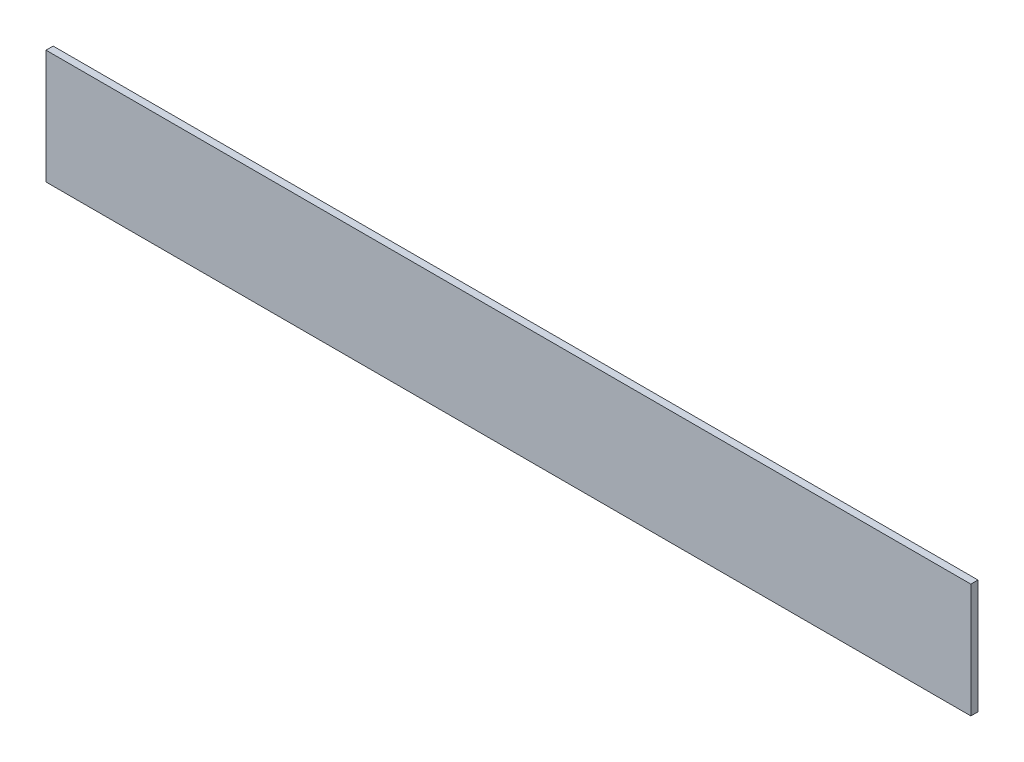
ISO-10303-21;
HEADER;
FILE_DESCRIPTION(('STEP AP214'),'2;1');
FILE_NAME('part.step','',(''),(''),'','','');
FILE_SCHEMA(('AUTOMOTIVE_DESIGN { 1 0 10303 214 1 1 1 1 }'));
ENDSEC;
DATA;
#1=APPLICATION_CONTEXT('core data for automotive mechanical design processes');
#2=APPLICATION_PROTOCOL_DEFINITION('international standard','automotive_design',2000,#1);
#3=PRODUCT_CONTEXT('',#1,'mechanical');
#4=PRODUCT('Part','Part','',(#3));
#5=PRODUCT_RELATED_PRODUCT_CATEGORY('part','',(#4));
#6=PRODUCT_DEFINITION_FORMATION('','',#4);
#7=PRODUCT_DEFINITION_CONTEXT('part definition',#1,'design');
#8=PRODUCT_DEFINITION('design','',#6,#7);
#9=PRODUCT_DEFINITION_SHAPE('','',#8);
#10=(LENGTH_UNIT() NAMED_UNIT(*) SI_UNIT(.MILLI.,.METRE.));
#11=(NAMED_UNIT(*) PLANE_ANGLE_UNIT() SI_UNIT($,.RADIAN.));
#12=(NAMED_UNIT(*) SI_UNIT($,.STERADIAN.) SOLID_ANGLE_UNIT());
#13=UNCERTAINTY_MEASURE_WITH_UNIT(LENGTH_MEASURE(1.E-05),#10,'distance_accuracy_value','');
#14=(GEOMETRIC_REPRESENTATION_CONTEXT(3) GLOBAL_UNCERTAINTY_ASSIGNED_CONTEXT((#13)) GLOBAL_UNIT_ASSIGNED_CONTEXT((#10,
#11,#12)) REPRESENTATION_CONTEXT('',''));
#15=CARTESIAN_POINT('',(0.,0.,0.));
#16=DIRECTION('',(0.,0.,1.));
#17=DIRECTION('',(1.,0.,0.));
#18=AXIS2_PLACEMENT_3D('',#15,#16,#17);
#19=CARTESIAN_POINT('',(0.,0.,6.35));
#20=DIRECTION('',(-1.,0.,0.));
#21=DIRECTION('',(0.,0.,1.));
#22=AXIS2_PLACEMENT_3D('',#19,#20,#21);
#23=PLANE('',#22);
#24=DIRECTION('',(0.,1.,0.));
#25=VECTOR('',#24,1.);
#26=CARTESIAN_POINT('',(0.,0.,0.));
#27=LINE('',#26,#25);
#28=CARTESIAN_POINT('',(0.,0.,0.));
#29=VERTEX_POINT('',#28);
#30=CARTESIAN_POINT('',(0.,101.6,0.));
#31=VERTEX_POINT('',#30);
#32=EDGE_CURVE('E98',#29,#31,#27,.T.);
#33=ORIENTED_EDGE('',*,*,#32,.F.);
#34=DIRECTION('',(0.,0.,-1.));
#35=VECTOR('',#34,1.);
#36=CARTESIAN_POINT('',(0.,0.,6.35));
#37=LINE('',#36,#35);
#38=CARTESIAN_POINT('',(0.,0.,6.35));
#39=VERTEX_POINT('',#38);
#40=EDGE_CURVE('E11',#39,#29,#37,.T.);
#41=ORIENTED_EDGE('',*,*,#40,.F.);
#42=DIRECTION('',(0.,1.,0.));
#43=VECTOR('',#42,1.);
#44=CARTESIAN_POINT('',(0.,0.,6.35));
#45=LINE('',#44,#43);
#46=CARTESIAN_POINT('',(0.,101.6,6.35));
#47=VERTEX_POINT('',#46);
#48=EDGE_CURVE('E93',#39,#47,#45,.T.);
#49=ORIENTED_EDGE('',*,*,#48,.T.);
#50=DIRECTION('',(0.,0.,-1.));
#51=VECTOR('',#50,1.);
#52=CARTESIAN_POINT('',(0.,101.6,6.35));
#53=LINE('',#52,#51);
#54=EDGE_CURVE('E36',#47,#31,#53,.T.);
#55=ORIENTED_EDGE('',*,*,#54,.T.);
#56=EDGE_LOOP('',(#33,#41,#49,#55));
#57=FACE_BOUND('',#56,.T.);
#58=ADVANCED_FACE('F33',(#57),#23,.T.);
#59=CARTESIAN_POINT('',(0.,0.,6.35));
#60=DIRECTION('',(0.,1.,0.));
#61=DIRECTION('',(0.,0.,1.));
#62=AXIS2_PLACEMENT_3D('',#59,#60,#61);
#63=PLANE('',#62);
#64=DIRECTION('',(1.,0.,0.));
#65=VECTOR('',#64,1.);
#66=CARTESIAN_POINT('',(0.,0.,0.));
#67=LINE('',#66,#65);
#68=CARTESIAN_POINT('',(822.959999999999,0.,0.));
#69=VERTEX_POINT('',#68);
#70=EDGE_CURVE('E66',#29,#69,#67,.T.);
#71=ORIENTED_EDGE('',*,*,#70,.T.);
#72=DIRECTION('',(0.,0.,-1.));
#73=VECTOR('',#72,1.);
#74=CARTESIAN_POINT('',(822.959999999999,0.,6.35));
#75=LINE('',#74,#73);
#76=CARTESIAN_POINT('',(822.959999999999,0.,6.35));
#77=VERTEX_POINT('',#76);
#78=EDGE_CURVE('E42',#77,#69,#75,.T.);
#79=ORIENTED_EDGE('',*,*,#78,.F.);
#80=DIRECTION('',(1.,0.,0.));
#81=VECTOR('',#80,1.);
#82=CARTESIAN_POINT('',(0.,0.,6.35));
#83=LINE('',#82,#81);
#84=EDGE_CURVE('E83',#39,#77,#83,.T.);
#85=ORIENTED_EDGE('',*,*,#84,.F.);
#86=ORIENTED_EDGE('',*,*,#40,.T.);
#87=EDGE_LOOP('',(#71,#79,#85,#86));
#88=FACE_BOUND('',#87,.T.);
#89=ADVANCED_FACE('F108',(#88),#63,.F.);
#90=CARTESIAN_POINT('',(822.959999999999,0.,6.35));
#91=DIRECTION('',(-1.,0.,0.));
#92=DIRECTION('',(0.,0.,1.));
#93=AXIS2_PLACEMENT_3D('',#90,#91,#92);
#94=PLANE('',#93);
#95=DIRECTION('',(0.,1.,0.));
#96=VECTOR('',#95,1.);
#97=CARTESIAN_POINT('',(822.959999999999,0.,0.));
#98=LINE('',#97,#96);
#99=CARTESIAN_POINT('',(822.959999999999,101.6,0.));
#100=VERTEX_POINT('',#99);
#101=EDGE_CURVE('E90',#69,#100,#98,.T.);
#102=ORIENTED_EDGE('',*,*,#101,.T.);
#103=DIRECTION('',(0.,0.,-1.));
#104=VECTOR('',#103,1.);
#105=CARTESIAN_POINT('',(822.959999999999,101.6,6.35));
#106=LINE('',#105,#104);
#107=CARTESIAN_POINT('',(822.959999999999,101.6,6.35));
#108=VERTEX_POINT('',#107);
#109=EDGE_CURVE('E87',#108,#100,#106,.T.);
#110=ORIENTED_EDGE('',*,*,#109,.F.);
#111=DIRECTION('',(0.,1.,0.));
#112=VECTOR('',#111,1.);
#113=CARTESIAN_POINT('',(822.959999999999,0.,6.35));
#114=LINE('',#113,#112);
#115=EDGE_CURVE('E78',#77,#108,#114,.T.);
#116=ORIENTED_EDGE('',*,*,#115,.F.);
#117=ORIENTED_EDGE('',*,*,#78,.T.);
#118=EDGE_LOOP('',(#102,#110,#116,#117));
#119=FACE_BOUND('',#118,.T.);
#120=ADVANCED_FACE('F88',(#119),#94,.F.);
#121=CARTESIAN_POINT('',(0.,101.6,6.35));
#122=DIRECTION('',(0.,1.,0.));
#123=DIRECTION('',(0.,0.,1.));
#124=AXIS2_PLACEMENT_3D('',#121,#122,#123);
#125=PLANE('',#124);
#126=DIRECTION('',(1.,0.,0.));
#127=VECTOR('',#126,1.);
#128=CARTESIAN_POINT('',(0.,101.6,0.));
#129=LINE('',#128,#127);
#130=EDGE_CURVE('E101',#31,#100,#129,.T.);
#131=ORIENTED_EDGE('',*,*,#130,.F.);
#132=ORIENTED_EDGE('',*,*,#54,.F.);
#133=DIRECTION('',(1.,0.,0.));
#134=VECTOR('',#133,1.);
#135=CARTESIAN_POINT('',(0.,101.6,6.35));
#136=LINE('',#135,#134);
#137=EDGE_CURVE('E82',#47,#108,#136,.T.);
#138=ORIENTED_EDGE('',*,*,#137,.T.);
#139=ORIENTED_EDGE('',*,*,#109,.T.);
#140=EDGE_LOOP('',(#131,#132,#138,#139));
#141=FACE_BOUND('',#140,.T.);
#142=ADVANCED_FACE('F92',(#141),#125,.T.);
#143=CARTESIAN_POINT('',(0.,0.,6.35));
#144=DIRECTION('',(0.,0.,-1.));
#145=DIRECTION('',(-1.,0.,0.));
#146=AXIS2_PLACEMENT_3D('',#143,#144,#145);
#147=PLANE('',#146);
#148=ORIENTED_EDGE('',*,*,#48,.F.);
#149=ORIENTED_EDGE('',*,*,#84,.T.);
#150=ORIENTED_EDGE('',*,*,#115,.T.);
#151=ORIENTED_EDGE('',*,*,#137,.F.);
#152=EDGE_LOOP('',(#148,#149,#150,#151));
#153=FACE_BOUND('',#152,.T.);
#154=ADVANCED_FACE('F81',(#153),#147,.F.);
#155=CARTESIAN_POINT('',(0.,0.,0.));
#156=DIRECTION('',(0.,0.,-1.));
#157=DIRECTION('',(-1.,0.,0.));
#158=AXIS2_PLACEMENT_3D('',#155,#156,#157);
#159=PLANE('',#158);
#160=ORIENTED_EDGE('',*,*,#32,.T.);
#161=ORIENTED_EDGE('',*,*,#130,.T.);
#162=ORIENTED_EDGE('',*,*,#101,.F.);
#163=ORIENTED_EDGE('',*,*,#70,.F.);
#164=EDGE_LOOP('',(#160,#161,#162,#163));
#165=FACE_BOUND('',#164,.T.);
#166=ADVANCED_FACE('F106',(#165),#159,.T.);
#167=CLOSED_SHELL('',(#58,#89,#120,#142,#154,#166));
#168=MANIFOLD_SOLID_BREP('B2',#167);
#169=ADVANCED_BREP_SHAPE_REPRESENTATION('',(#18,#168),#14);
#170=SHAPE_DEFINITION_REPRESENTATION(#9,#169);
ENDSEC;
END-ISO-10303-21;
